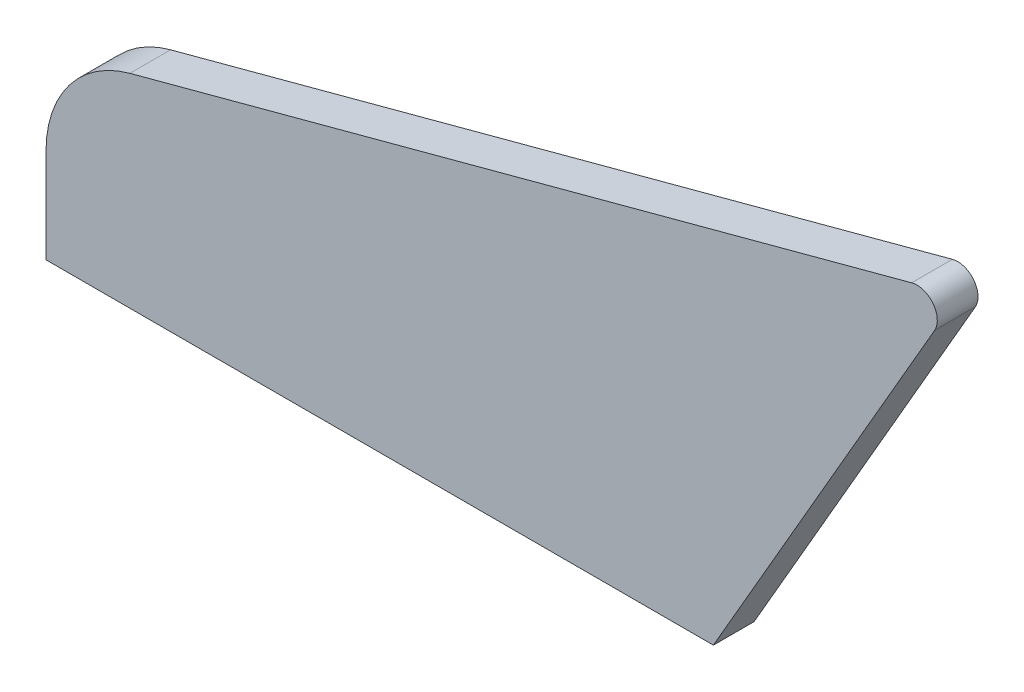
ISO-10303-21;
HEADER;
FILE_DESCRIPTION(('STEP AP214'),'2;1');
FILE_NAME('part.step','',(''),(''),'','','');
FILE_SCHEMA(('AUTOMOTIVE_DESIGN { 1 0 10303 214 1 1 1 1 }'));
ENDSEC;
DATA;
#1=APPLICATION_CONTEXT('core data for automotive mechanical design processes');
#2=APPLICATION_PROTOCOL_DEFINITION('international standard','automotive_design',2000,#1);
#3=PRODUCT_CONTEXT('',#1,'mechanical');
#4=PRODUCT('Part','Part','',(#3));
#5=PRODUCT_RELATED_PRODUCT_CATEGORY('part','',(#4));
#6=PRODUCT_DEFINITION_FORMATION('','',#4);
#7=PRODUCT_DEFINITION_CONTEXT('part definition',#1,'design');
#8=PRODUCT_DEFINITION('design','',#6,#7);
#9=PRODUCT_DEFINITION_SHAPE('','',#8);
#10=(LENGTH_UNIT() NAMED_UNIT(*) SI_UNIT(.MILLI.,.METRE.));
#11=(NAMED_UNIT(*) PLANE_ANGLE_UNIT() SI_UNIT($,.RADIAN.));
#12=(NAMED_UNIT(*) SI_UNIT($,.STERADIAN.) SOLID_ANGLE_UNIT());
#13=UNCERTAINTY_MEASURE_WITH_UNIT(LENGTH_MEASURE(1.E-05),#10,'distance_accuracy_value','');
#14=(GEOMETRIC_REPRESENTATION_CONTEXT(3) GLOBAL_UNCERTAINTY_ASSIGNED_CONTEXT((#13)) GLOBAL_UNIT_ASSIGNED_CONTEXT((#10,
#11,#12)) REPRESENTATION_CONTEXT('',''));
#15=CARTESIAN_POINT('',(0.,0.,0.));
#16=DIRECTION('',(0.,0.,1.));
#17=DIRECTION('',(1.,0.,0.));
#18=AXIS2_PLACEMENT_3D('',#15,#16,#17);
#19=CARTESIAN_POINT('',(0.,80.,18.));
#20=DIRECTION('',(1.,0.,0.));
#21=DIRECTION('',(0.,1.,0.));
#22=AXIS2_PLACEMENT_3D('',#19,#20,#21);
#23=PLANE('',#22);
#24=DIRECTION('',(0.,-1.,0.));
#25=VECTOR('',#24,1.);
#26=CARTESIAN_POINT('',(0.,80.,18.));
#27=LINE('',#26,#25);
#28=CARTESIAN_POINT('',(0.,41.6336506010517,18.));
#29=VERTEX_POINT('',#28);
#30=CARTESIAN_POINT('',(0.,0.,18.));
#31=VERTEX_POINT('',#30);
#32=EDGE_CURVE('E85',#29,#31,#27,.T.);
#33=ORIENTED_EDGE('',*,*,#32,.F.);
#34=DIRECTION('',(0.,0.,-1.));
#35=VECTOR('',#34,1.);
#36=CARTESIAN_POINT('',(0.,41.6336506010517,18.));
#37=LINE('',#36,#35);
#38=CARTESIAN_POINT('',(0.,41.6336506010517,0.));
#39=VERTEX_POINT('',#38);
#40=EDGE_CURVE('E109',#29,#39,#37,.T.);
#41=ORIENTED_EDGE('',*,*,#40,.T.);
#42=DIRECTION('',(0.,-1.,0.));
#43=VECTOR('',#42,1.);
#44=CARTESIAN_POINT('',(0.,80.,0.));
#45=LINE('',#44,#43);
#46=CARTESIAN_POINT('',(0.,0.,0.));
#47=VERTEX_POINT('',#46);
#48=EDGE_CURVE('E107',#39,#47,#45,.T.);
#49=ORIENTED_EDGE('',*,*,#48,.T.);
#50=DIRECTION('',(0.,0.,-1.));
#51=VECTOR('',#50,1.);
#52=CARTESIAN_POINT('',(0.,0.,18.));
#53=LINE('',#52,#51);
#54=EDGE_CURVE('E101',#31,#47,#53,.T.);
#55=ORIENTED_EDGE('',*,*,#54,.F.);
#56=EDGE_LOOP('',(#33,#41,#49,#55));
#57=FACE_BOUND('',#56,.T.);
#58=ADVANCED_FACE('F33',(#57),#23,.F.);
#59=CARTESIAN_POINT('',(0.,0.,18.));
#60=DIRECTION('',(0.,1.,0.));
#61=DIRECTION('',(0.,0.,1.));
#62=AXIS2_PLACEMENT_3D('',#59,#60,#61);
#63=PLANE('',#62);
#64=DIRECTION('',(1.,0.,0.));
#65=VECTOR('',#64,1.);
#66=CARTESIAN_POINT('',(0.,0.,0.));
#67=LINE('',#66,#65);
#68=CARTESIAN_POINT('',(295.,0.,0.));
#69=VERTEX_POINT('',#68);
#70=EDGE_CURVE('E135',#47,#69,#67,.T.);
#71=ORIENTED_EDGE('',*,*,#70,.T.);
#72=DIRECTION('',(0.,0.,-1.));
#73=VECTOR('',#72,1.);
#74=CARTESIAN_POINT('',(295.,0.,18.));
#75=LINE('',#74,#73);
#76=CARTESIAN_POINT('',(295.,0.,18.));
#77=VERTEX_POINT('',#76);
#78=EDGE_CURVE('E103',#77,#69,#75,.T.);
#79=ORIENTED_EDGE('',*,*,#78,.F.);
#80=DIRECTION('',(1.,0.,0.));
#81=VECTOR('',#80,1.);
#82=CARTESIAN_POINT('',(0.,0.,18.));
#83=LINE('',#82,#81);
#84=EDGE_CURVE('E88',#31,#77,#83,.T.);
#85=ORIENTED_EDGE('',*,*,#84,.F.);
#86=ORIENTED_EDGE('',*,*,#54,.T.);
#87=EDGE_LOOP('',(#71,#79,#85,#86));
#88=FACE_BOUND('',#87,.T.);
#89=ADVANCED_FACE('F100',(#88),#63,.F.);
#90=CARTESIAN_POINT('',(295.,0.,18.));
#91=DIRECTION('',(-0.86602540378444,0.499999999999998,0.));
#92=DIRECTION('',(-0.499999999999998,-0.86602540378444,0.));
#93=AXIS2_PLACEMENT_3D('',#90,#91,#92);
#94=PLANE('',#93);
#95=DIRECTION('',(0.499999999999998,0.86602540378444,0.));
#96=VECTOR('',#95,1.);
#97=CARTESIAN_POINT('',(295.,0.,0.));
#98=LINE('',#97,#96);
#99=CARTESIAN_POINT('',(392.765802178901,169.335336616585,0.));
#100=VERTEX_POINT('',#99);
#101=EDGE_CURVE('E134',#69,#100,#98,.T.);
#102=ORIENTED_EDGE('',*,*,#101,.T.);
#103=DIRECTION('',(0.,0.,-1.));
#104=VECTOR('',#103,1.);
#105=CARTESIAN_POINT('',(392.765802178901,169.335336616585,18.));
#106=LINE('',#105,#104);
#107=CARTESIAN_POINT('',(392.765802178901,169.335336616585,18.));
#108=VERTEX_POINT('',#107);
#109=EDGE_CURVE('E41',#100,#108,#106,.F.);
#110=ORIENTED_EDGE('',*,*,#109,.T.);
#111=DIRECTION('',(0.499999999999998,0.86602540378444,0.));
#112=VECTOR('',#111,1.);
#113=CARTESIAN_POINT('',(295.,0.,18.));
#114=LINE('',#113,#112);
#115=EDGE_CURVE('E104',#77,#108,#114,.T.);
#116=ORIENTED_EDGE('',*,*,#115,.F.);
#117=ORIENTED_EDGE('',*,*,#78,.T.);
#118=EDGE_LOOP('',(#102,#110,#116,#117));
#119=FACE_BOUND('',#118,.T.);
#120=ADVANCED_FACE('F152',(#119),#94,.F.);
#121=CARTESIAN_POINT('',(403.62976320958,188.152269093169,18.));
#122=DIRECTION('',(0.258819045102514,-0.96592582628907,0.));
#123=DIRECTION('',(0.96592582628907,0.258819045102514,0.));
#124=AXIS2_PLACEMENT_3D('',#121,#122,#123);
#125=PLANE('',#124);
#126=DIRECTION('',(-0.96592582628907,-0.258819045102515,0.));
#127=VECTOR('',#126,1.);
#128=CARTESIAN_POINT('',(403.62976320958,188.152269093169,18.));
#129=LINE('',#128,#127);
#130=CARTESIAN_POINT('',(382.642202138918,182.528669053187,18.));
#131=VERTEX_POINT('',#130);
#132=CARTESIAN_POINT('',(37.0590477448743,89.9299419155052,18.));
#133=VERTEX_POINT('',#132);
#134=EDGE_CURVE('E113',#131,#133,#129,.T.);
#135=ORIENTED_EDGE('',*,*,#134,.F.);
#136=DIRECTION('',(0.,0.,-1.));
#137=VECTOR('',#136,1.);
#138=CARTESIAN_POINT('',(382.642202138918,182.528669053187,18.));
#139=LINE('',#138,#137);
#140=CARTESIAN_POINT('',(382.642202138918,182.528669053187,0.));
#141=VERTEX_POINT('',#140);
#142=EDGE_CURVE('E123',#131,#141,#139,.T.);
#143=ORIENTED_EDGE('',*,*,#142,.T.);
#144=DIRECTION('',(-0.96592582628907,-0.258819045102515,0.));
#145=VECTOR('',#144,1.);
#146=CARTESIAN_POINT('',(403.62976320958,188.152269093169,0.));
#147=LINE('',#146,#145);
#148=CARTESIAN_POINT('',(37.0590477448743,89.9299419155052,0.));
#149=VERTEX_POINT('',#148);
#150=EDGE_CURVE('E96',#141,#149,#147,.T.);
#151=ORIENTED_EDGE('',*,*,#150,.T.);
#152=DIRECTION('',(0.,0.,-1.));
#153=VECTOR('',#152,1.);
#154=CARTESIAN_POINT('',(37.0590477448743,89.9299419155052,18.));
#155=LINE('',#154,#153);
#156=EDGE_CURVE('E119',#149,#133,#155,.F.);
#157=ORIENTED_EDGE('',*,*,#156,.T.);
#158=EDGE_LOOP('',(#135,#143,#151,#157));
#159=FACE_BOUND('',#158,.T.);
#160=ADVANCED_FACE('F129',(#159),#125,.F.);
#161=CARTESIAN_POINT('',(0.,0.,18.));
#162=DIRECTION('',(0.,0.,1.));
#163=DIRECTION('',(1.,0.,0.));
#164=AXIS2_PLACEMENT_3D('',#161,#162,#163);
#165=PLANE('',#164);
#166=ORIENTED_EDGE('',*,*,#115,.T.);
#167=CARTESIAN_POINT('',(384.971573544841,173.835336616585,18.));
#168=DIRECTION('',(0.,0.,1.));
#169=DIRECTION('',(1.,0.,0.));
#170=AXIS2_PLACEMENT_3D('',#167,#168,#169);
#171=CIRCLE('',#170,9.);
#172=EDGE_CURVE('E11',#108,#131,#171,.T.);
#173=ORIENTED_EDGE('',*,*,#172,.T.);
#174=ORIENTED_EDGE('',*,*,#134,.T.);
#175=CARTESIAN_POINT('',(50.,41.6336506010517,18.));
#176=DIRECTION('',(0.,0.,1.));
#177=DIRECTION('',(1.,0.,0.));
#178=AXIS2_PLACEMENT_3D('',#175,#176,#177);
#179=CIRCLE('',#178,50.);
#180=EDGE_CURVE('E91',#133,#29,#179,.T.);
#181=ORIENTED_EDGE('',*,*,#180,.T.);
#182=ORIENTED_EDGE('',*,*,#32,.T.);
#183=ORIENTED_EDGE('',*,*,#84,.T.);
#184=EDGE_LOOP('',(#166,#173,#174,#181,#182,#183));
#185=FACE_BOUND('',#184,.T.);
#186=ADVANCED_FACE('F87',(#185),#165,.T.);
#187=CARTESIAN_POINT('',(0.,0.,0.));
#188=DIRECTION('',(0.,0.,1.));
#189=DIRECTION('',(1.,0.,0.));
#190=AXIS2_PLACEMENT_3D('',#187,#188,#189);
#191=PLANE('',#190);
#192=ORIENTED_EDGE('',*,*,#150,.F.);
#193=CARTESIAN_POINT('',(384.971573544841,173.835336616585,0.));
#194=DIRECTION('',(0.,0.,1.));
#195=DIRECTION('',(1.,0.,0.));
#196=AXIS2_PLACEMENT_3D('',#193,#194,#195);
#197=CIRCLE('',#196,9.);
#198=EDGE_CURVE('E55',#141,#100,#197,.F.);
#199=ORIENTED_EDGE('',*,*,#198,.T.);
#200=ORIENTED_EDGE('',*,*,#101,.F.);
#201=ORIENTED_EDGE('',*,*,#70,.F.);
#202=ORIENTED_EDGE('',*,*,#48,.F.);
#203=CARTESIAN_POINT('',(50.,41.6336506010517,0.));
#204=DIRECTION('',(0.,0.,1.));
#205=DIRECTION('',(1.,0.,0.));
#206=AXIS2_PLACEMENT_3D('',#203,#204,#205);
#207=CIRCLE('',#206,50.);
#208=EDGE_CURVE('E111',#39,#149,#207,.F.);
#209=ORIENTED_EDGE('',*,*,#208,.T.);
#210=EDGE_LOOP('',(#192,#199,#200,#201,#202,#209));
#211=FACE_BOUND('',#210,.T.);
#212=ADVANCED_FACE('F132',(#211),#191,.F.);
#213=CARTESIAN_POINT('',(50.,41.6336506010517,18.));
#214=DIRECTION('',(0.,0.,-1.));
#215=DIRECTION('',(-1.,0.,0.));
#216=AXIS2_PLACEMENT_3D('',#213,#214,#215);
#217=CYLINDRICAL_SURFACE('',#216,50.);
#218=ORIENTED_EDGE('',*,*,#180,.F.);
#219=ORIENTED_EDGE('',*,*,#156,.F.);
#220=ORIENTED_EDGE('',*,*,#208,.F.);
#221=ORIENTED_EDGE('',*,*,#40,.F.);
#222=EDGE_LOOP('',(#218,#219,#220,#221));
#223=FACE_BOUND('',#222,.T.);
#224=ADVANCED_FACE('F142',(#223),#217,.T.);
#225=CARTESIAN_POINT('',(384.971573544841,173.835336616585,18.));
#226=DIRECTION('',(0.,0.,-1.));
#227=DIRECTION('',(-1.,0.,0.));
#228=AXIS2_PLACEMENT_3D('',#225,#226,#227);
#229=CYLINDRICAL_SURFACE('',#228,9.);
#230=ORIENTED_EDGE('',*,*,#172,.F.);
#231=ORIENTED_EDGE('',*,*,#109,.F.);
#232=ORIENTED_EDGE('',*,*,#198,.F.);
#233=ORIENTED_EDGE('',*,*,#142,.F.);
#234=EDGE_LOOP('',(#230,#231,#232,#233));
#235=FACE_BOUND('',#234,.T.);
#236=ADVANCED_FACE('F35',(#235),#229,.T.);
#237=CLOSED_SHELL('',(#58,#89,#120,#160,#186,#212,#224,#236));
#238=MANIFOLD_SOLID_BREP('B2',#237);
#239=ADVANCED_BREP_SHAPE_REPRESENTATION('',(#18,#238),#14);
#240=SHAPE_DEFINITION_REPRESENTATION(#9,#239);
ENDSEC;
END-ISO-10303-21;
